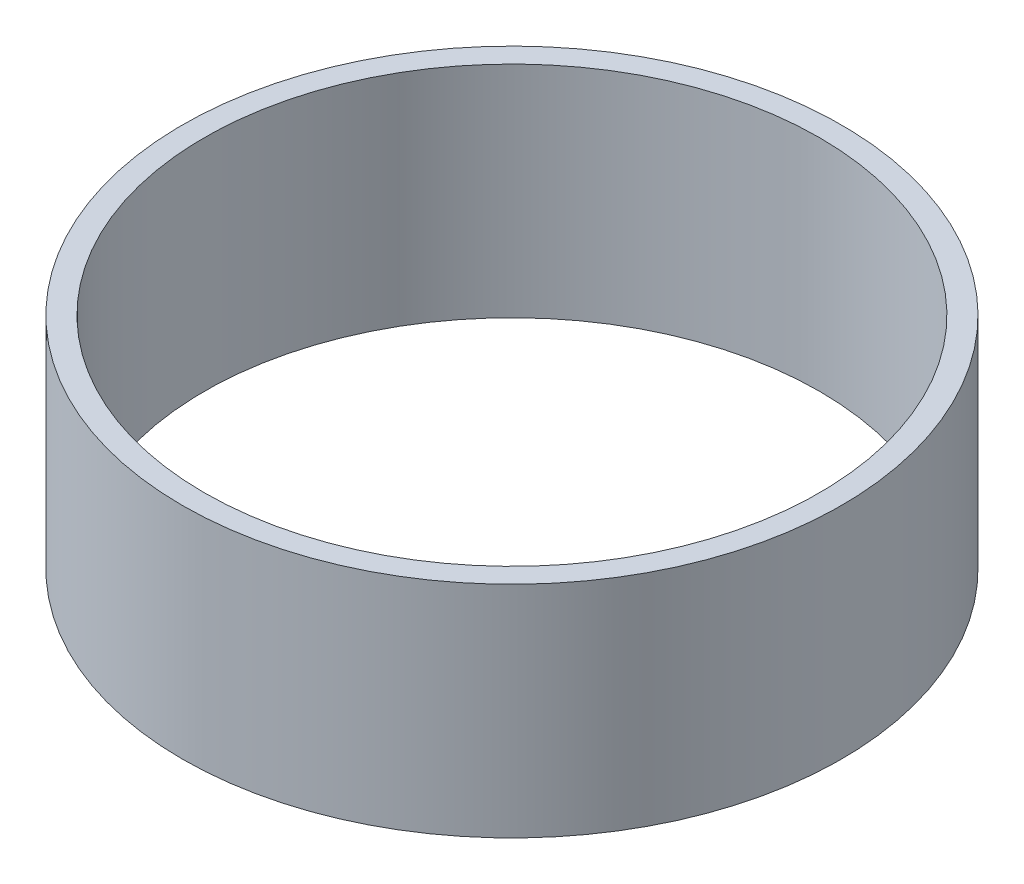
ISO-10303-21;
HEADER;
FILE_DESCRIPTION(('STEP AP214'),'2;1');
FILE_NAME('part.step','',(''),(''),'','','');
FILE_SCHEMA(('AUTOMOTIVE_DESIGN { 1 0 10303 214 1 1 1 1 }'));
ENDSEC;
DATA;
#1=APPLICATION_CONTEXT('core data for automotive mechanical design processes');
#2=APPLICATION_PROTOCOL_DEFINITION('international standard','automotive_design',2000,#1);
#3=PRODUCT_CONTEXT('',#1,'mechanical');
#4=PRODUCT('Part','Part','',(#3));
#5=PRODUCT_RELATED_PRODUCT_CATEGORY('part','',(#4));
#6=PRODUCT_DEFINITION_FORMATION('','',#4);
#7=PRODUCT_DEFINITION_CONTEXT('part definition',#1,'design');
#8=PRODUCT_DEFINITION('design','',#6,#7);
#9=PRODUCT_DEFINITION_SHAPE('','',#8);
#10=(LENGTH_UNIT() NAMED_UNIT(*) SI_UNIT(.MILLI.,.METRE.));
#11=(NAMED_UNIT(*) PLANE_ANGLE_UNIT() SI_UNIT($,.RADIAN.));
#12=(NAMED_UNIT(*) SI_UNIT($,.STERADIAN.) SOLID_ANGLE_UNIT());
#13=UNCERTAINTY_MEASURE_WITH_UNIT(LENGTH_MEASURE(1.E-05),#10,'distance_accuracy_value','');
#14=(GEOMETRIC_REPRESENTATION_CONTEXT(3) GLOBAL_UNCERTAINTY_ASSIGNED_CONTEXT((#13)) GLOBAL_UNIT_ASSIGNED_CONTEXT((#10,
#11,#12)) REPRESENTATION_CONTEXT('',''));
#15=CARTESIAN_POINT('',(0.,0.,0.));
#16=DIRECTION('',(0.,0.,1.));
#17=DIRECTION('',(1.,0.,0.));
#18=AXIS2_PLACEMENT_3D('',#15,#16,#17);
#19=CARTESIAN_POINT('',(0.,25.,0.));
#20=DIRECTION('',(0.,1.,0.));
#21=DIRECTION('',(0.,0.,1.));
#22=AXIS2_PLACEMENT_3D('',#19,#20,#21);
#23=PLANE('',#22);
#24=CARTESIAN_POINT('',(0.,25.,0.));
#25=DIRECTION('',(0.,1.,0.));
#26=DIRECTION('',(0.,0.,1.));
#27=AXIS2_PLACEMENT_3D('',#24,#25,#26);
#28=CIRCLE('',#27,75.);
#29=CARTESIAN_POINT('',(0.,25.,75.));
#30=VERTEX_POINT('',#29);
#31=EDGE_CURVE('E10',#30,#30,#28,.T.);
#32=ORIENTED_EDGE('',*,*,#31,.T.);
#33=EDGE_LOOP('',(#32));
#34=FACE_BOUND('',#33,.T.);
#35=CARTESIAN_POINT('',(0.,25.,0.));
#36=DIRECTION('',(0.,1.,0.));
#37=DIRECTION('',(0.,0.,1.));
#38=AXIS2_PLACEMENT_3D('',#35,#36,#37);
#39=CIRCLE('',#38,70.);
#40=CARTESIAN_POINT('',(0.,25.,70.));
#41=VERTEX_POINT('',#40);
#42=EDGE_CURVE('E46',#41,#41,#39,.T.);
#43=ORIENTED_EDGE('',*,*,#42,.F.);
#44=EDGE_LOOP('',(#43));
#45=FACE_BOUND('',#44,.T.);
#46=ADVANCED_FACE('F35',(#34,#45),#23,.T.);
#47=CARTESIAN_POINT('',(0.,-25.,0.));
#48=DIRECTION('',(0.,1.,0.));
#49=DIRECTION('',(0.,0.,1.));
#50=AXIS2_PLACEMENT_3D('',#47,#48,#49);
#51=PLANE('',#50);
#52=CARTESIAN_POINT('',(0.,-25.,0.));
#53=DIRECTION('',(0.,1.,0.));
#54=DIRECTION('',(0.,0.,1.));
#55=AXIS2_PLACEMENT_3D('',#52,#53,#54);
#56=CIRCLE('',#55,75.);
#57=CARTESIAN_POINT('',(0.,-25.,75.));
#58=VERTEX_POINT('',#57);
#59=EDGE_CURVE('E39',#58,#58,#56,.T.);
#60=ORIENTED_EDGE('',*,*,#59,.F.);
#61=EDGE_LOOP('',(#60));
#62=FACE_BOUND('',#61,.T.);
#63=CARTESIAN_POINT('',(0.,-25.,0.));
#64=DIRECTION('',(0.,1.,0.));
#65=DIRECTION('',(0.,0.,1.));
#66=AXIS2_PLACEMENT_3D('',#63,#64,#65);
#67=CIRCLE('',#66,70.);
#68=CARTESIAN_POINT('',(0.,-25.,70.));
#69=VERTEX_POINT('',#68);
#70=EDGE_CURVE('E48',#69,#69,#67,.T.);
#71=ORIENTED_EDGE('',*,*,#70,.T.);
#72=EDGE_LOOP('',(#71));
#73=FACE_BOUND('',#72,.T.);
#74=ADVANCED_FACE('F58',(#62,#73),#51,.F.);
#75=CARTESIAN_POINT('',(0.,25.,0.));
#76=DIRECTION('',(0.,-1.,0.));
#77=DIRECTION('',(0.,0.,-1.));
#78=AXIS2_PLACEMENT_3D('',#75,#76,#77);
#79=CYLINDRICAL_SURFACE('',#78,75.);
#80=ORIENTED_EDGE('',*,*,#31,.F.);
#81=EDGE_LOOP('',(#80));
#82=FACE_BOUND('',#81,.T.);
#83=ORIENTED_EDGE('',*,*,#59,.T.);
#84=EDGE_LOOP('',(#83));
#85=FACE_BOUND('',#84,.T.);
#86=ADVANCED_FACE('F37',(#82,#85),#79,.T.);
#87=CARTESIAN_POINT('',(0.,25.,0.));
#88=DIRECTION('',(0.,-1.,0.));
#89=DIRECTION('',(0.,0.,-1.));
#90=AXIS2_PLACEMENT_3D('',#87,#88,#89);
#91=CYLINDRICAL_SURFACE('',#90,70.);
#92=ORIENTED_EDGE('',*,*,#42,.T.);
#93=EDGE_LOOP('',(#92));
#94=FACE_BOUND('',#93,.T.);
#95=ORIENTED_EDGE('',*,*,#70,.F.);
#96=EDGE_LOOP('',(#95));
#97=FACE_BOUND('',#96,.T.);
#98=ADVANCED_FACE('F54',(#94,#97),#91,.F.);
#99=CLOSED_SHELL('',(#46,#74,#86,#98));
#100=MANIFOLD_SOLID_BREP('B2',#99);
#101=ADVANCED_BREP_SHAPE_REPRESENTATION('',(#18,#100),#14);
#102=SHAPE_DEFINITION_REPRESENTATION(#9,#101);
ENDSEC;
END-ISO-10303-21;
